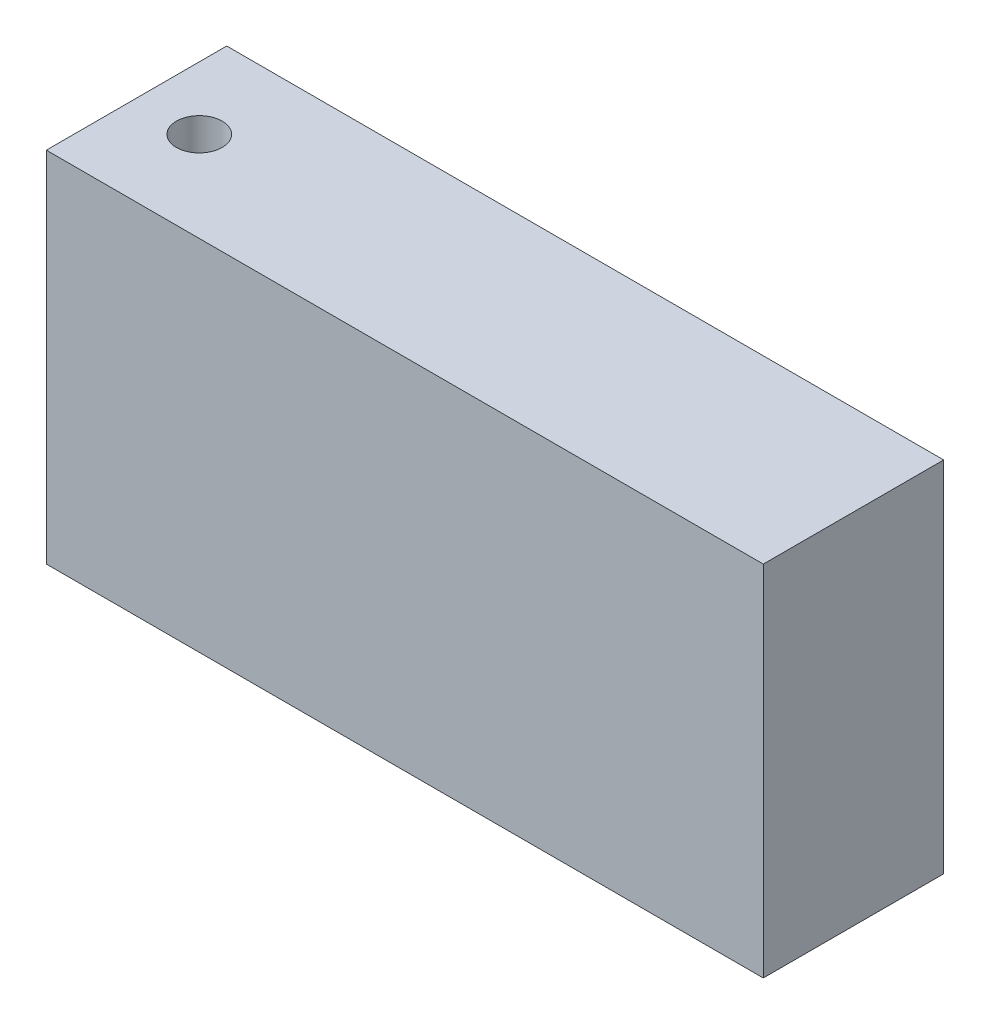
ISO-10303-21;
HEADER;
FILE_DESCRIPTION(('STEP AP214'),'2;1');
FILE_NAME('part.step','',(''),(''),'','','');
FILE_SCHEMA(('AUTOMOTIVE_DESIGN { 1 0 10303 214 1 1 1 1 }'));
ENDSEC;
DATA;
#1=APPLICATION_CONTEXT('core data for automotive mechanical design processes');
#2=APPLICATION_PROTOCOL_DEFINITION('international standard','automotive_design',2000,#1);
#3=PRODUCT_CONTEXT('',#1,'mechanical');
#4=PRODUCT('Part','Part','',(#3));
#5=PRODUCT_RELATED_PRODUCT_CATEGORY('part','',(#4));
#6=PRODUCT_DEFINITION_FORMATION('','',#4);
#7=PRODUCT_DEFINITION_CONTEXT('part definition',#1,'design');
#8=PRODUCT_DEFINITION('design','',#6,#7);
#9=PRODUCT_DEFINITION_SHAPE('','',#8);
#10=(LENGTH_UNIT() NAMED_UNIT(*) SI_UNIT(.MILLI.,.METRE.));
#11=(NAMED_UNIT(*) PLANE_ANGLE_UNIT() SI_UNIT($,.RADIAN.));
#12=(NAMED_UNIT(*) SI_UNIT($,.STERADIAN.) SOLID_ANGLE_UNIT());
#13=UNCERTAINTY_MEASURE_WITH_UNIT(LENGTH_MEASURE(1.E-05),#10,'distance_accuracy_value','');
#14=(GEOMETRIC_REPRESENTATION_CONTEXT(3) GLOBAL_UNCERTAINTY_ASSIGNED_CONTEXT((#13)) GLOBAL_UNIT_ASSIGNED_CONTEXT((#10,
#11,#12)) REPRESENTATION_CONTEXT('',''));
#15=CARTESIAN_POINT('',(0.,0.,0.));
#16=DIRECTION('',(0.,0.,1.));
#17=DIRECTION('',(1.,0.,0.));
#18=AXIS2_PLACEMENT_3D('',#15,#16,#17);
#19=CARTESIAN_POINT('',(-50.,50.,12.58));
#20=DIRECTION('',(1.,0.,0.));
#21=DIRECTION('',(0.,0.,-1.));
#22=AXIS2_PLACEMENT_3D('',#19,#20,#21);
#23=PLANE('',#22);
#24=DIRECTION('',(0.,0.,1.));
#25=VECTOR('',#24,1.);
#26=CARTESIAN_POINT('',(-50.,0.,12.58));
#27=LINE('',#26,#25);
#28=CARTESIAN_POINT('',(-50.,0.,-12.58));
#29=VERTEX_POINT('',#28);
#30=CARTESIAN_POINT('',(-50.,0.,12.58));
#31=VERTEX_POINT('',#30);
#32=EDGE_CURVE('E96',#29,#31,#27,.T.);
#33=ORIENTED_EDGE('',*,*,#32,.T.);
#34=DIRECTION('',(0.,-1.,0.));
#35=VECTOR('',#34,1.);
#36=CARTESIAN_POINT('',(-50.,50.,12.58));
#37=LINE('',#36,#35);
#38=CARTESIAN_POINT('',(-50.,50.,12.58));
#39=VERTEX_POINT('',#38);
#40=EDGE_CURVE('E11',#39,#31,#37,.T.);
#41=ORIENTED_EDGE('',*,*,#40,.F.);
#42=DIRECTION('',(0.,0.,1.));
#43=VECTOR('',#42,1.);
#44=CARTESIAN_POINT('',(-50.,50.,12.58));
#45=LINE('',#44,#43);
#46=CARTESIAN_POINT('',(-50.,50.,-12.58));
#47=VERTEX_POINT('',#46);
#48=EDGE_CURVE('E84',#47,#39,#45,.T.);
#49=ORIENTED_EDGE('',*,*,#48,.F.);
#50=DIRECTION('',(0.,-1.,0.));
#51=VECTOR('',#50,1.);
#52=CARTESIAN_POINT('',(-50.,50.,-12.58));
#53=LINE('',#52,#51);
#54=EDGE_CURVE('E92',#47,#29,#53,.T.);
#55=ORIENTED_EDGE('',*,*,#54,.T.);
#56=EDGE_LOOP('',(#33,#41,#49,#55));
#57=FACE_BOUND('',#56,.T.);
#58=ADVANCED_FACE('F33',(#57),#23,.F.);
#59=CARTESIAN_POINT('',(50.,50.,12.58));
#60=DIRECTION('',(0.,0.,-1.));
#61=DIRECTION('',(-1.,0.,0.));
#62=AXIS2_PLACEMENT_3D('',#59,#60,#61);
#63=PLANE('',#62);
#64=DIRECTION('',(1.,0.,0.));
#65=VECTOR('',#64,1.);
#66=CARTESIAN_POINT('',(50.,0.,12.58));
#67=LINE('',#66,#65);
#68=CARTESIAN_POINT('',(50.,0.,12.58));
#69=VERTEX_POINT('',#68);
#70=EDGE_CURVE('E88',#31,#69,#67,.T.);
#71=ORIENTED_EDGE('',*,*,#70,.T.);
#72=DIRECTION('',(0.,-1.,0.));
#73=VECTOR('',#72,1.);
#74=CARTESIAN_POINT('',(50.,50.,12.58));
#75=LINE('',#74,#73);
#76=CARTESIAN_POINT('',(50.,50.,12.58));
#77=VERTEX_POINT('',#76);
#78=EDGE_CURVE('E41',#77,#69,#75,.T.);
#79=ORIENTED_EDGE('',*,*,#78,.F.);
#80=DIRECTION('',(1.,0.,0.));
#81=VECTOR('',#80,1.);
#82=CARTESIAN_POINT('',(50.,50.,12.58));
#83=LINE('',#82,#81);
#84=EDGE_CURVE('E79',#39,#77,#83,.T.);
#85=ORIENTED_EDGE('',*,*,#84,.F.);
#86=ORIENTED_EDGE('',*,*,#40,.T.);
#87=EDGE_LOOP('',(#71,#79,#85,#86));
#88=FACE_BOUND('',#87,.T.);
#89=ADVANCED_FACE('F87',(#88),#63,.F.);
#90=CARTESIAN_POINT('',(50.,50.,12.58));
#91=DIRECTION('',(-1.,0.,0.));
#92=DIRECTION('',(0.,0.,1.));
#93=AXIS2_PLACEMENT_3D('',#90,#91,#92);
#94=PLANE('',#93);
#95=DIRECTION('',(0.,0.,-1.));
#96=VECTOR('',#95,1.);
#97=CARTESIAN_POINT('',(50.,0.,12.58));
#98=LINE('',#97,#96);
#99=CARTESIAN_POINT('',(50.,0.,-12.58));
#100=VERTEX_POINT('',#99);
#101=EDGE_CURVE('E66',#69,#100,#98,.T.);
#102=ORIENTED_EDGE('',*,*,#101,.T.);
#103=DIRECTION('',(0.,-1.,0.));
#104=VECTOR('',#103,1.);
#105=CARTESIAN_POINT('',(50.,50.,-12.58));
#106=LINE('',#105,#104);
#107=CARTESIAN_POINT('',(50.,50.,-12.58));
#108=VERTEX_POINT('',#107);
#109=EDGE_CURVE('E89',#108,#100,#106,.T.);
#110=ORIENTED_EDGE('',*,*,#109,.F.);
#111=DIRECTION('',(0.,0.,-1.));
#112=VECTOR('',#111,1.);
#113=CARTESIAN_POINT('',(50.,50.,12.58));
#114=LINE('',#113,#112);
#115=EDGE_CURVE('E82',#77,#108,#114,.T.);
#116=ORIENTED_EDGE('',*,*,#115,.F.);
#117=ORIENTED_EDGE('',*,*,#78,.T.);
#118=EDGE_LOOP('',(#102,#110,#116,#117));
#119=FACE_BOUND('',#118,.T.);
#120=ADVANCED_FACE('F90',(#119),#94,.F.);
#121=CARTESIAN_POINT('',(50.,50.,-12.58));
#122=DIRECTION('',(0.,0.,1.));
#123=DIRECTION('',(1.,0.,0.));
#124=AXIS2_PLACEMENT_3D('',#121,#122,#123);
#125=PLANE('',#124);
#126=DIRECTION('',(-1.,0.,0.));
#127=VECTOR('',#126,1.);
#128=CARTESIAN_POINT('',(50.,0.,-12.58));
#129=LINE('',#128,#127);
#130=EDGE_CURVE('E72',#100,#29,#129,.T.);
#131=ORIENTED_EDGE('',*,*,#130,.T.);
#132=ORIENTED_EDGE('',*,*,#54,.F.);
#133=DIRECTION('',(-1.,0.,0.));
#134=VECTOR('',#133,1.);
#135=CARTESIAN_POINT('',(50.,50.,-12.58));
#136=LINE('',#135,#134);
#137=EDGE_CURVE('E49',#108,#47,#136,.T.);
#138=ORIENTED_EDGE('',*,*,#137,.F.);
#139=ORIENTED_EDGE('',*,*,#109,.T.);
#140=EDGE_LOOP('',(#131,#132,#138,#139));
#141=FACE_BOUND('',#140,.T.);
#142=ADVANCED_FACE('F104',(#141),#125,.F.);
#143=CARTESIAN_POINT('',(0.,50.,0.));
#144=DIRECTION('',(0.,1.,0.));
#145=DIRECTION('',(0.,0.,1.));
#146=AXIS2_PLACEMENT_3D('',#143,#144,#145);
#147=PLANE('',#146);
#148=CARTESIAN_POINT('',(-41.25,50.,0.));
#149=DIRECTION('',(0.,1.,0.));
#150=DIRECTION('',(0.,0.,1.));
#151=AXIS2_PLACEMENT_3D('',#148,#149,#150);
#152=CIRCLE('',#151,3.19);
#153=CARTESIAN_POINT('',(-41.25,50.,3.18999999999999));
#154=VERTEX_POINT('',#153);
#155=EDGE_CURVE('E110',#154,#154,#152,.T.);
#156=ORIENTED_EDGE('',*,*,#155,.F.);
#157=EDGE_LOOP('',(#156));
#158=FACE_BOUND('',#157,.T.);
#159=ORIENTED_EDGE('',*,*,#48,.T.);
#160=ORIENTED_EDGE('',*,*,#84,.T.);
#161=ORIENTED_EDGE('',*,*,#115,.T.);
#162=ORIENTED_EDGE('',*,*,#137,.T.);
#163=EDGE_LOOP('',(#159,#160,#161,#162));
#164=FACE_BOUND('',#163,.T.);
#165=ADVANCED_FACE('F80',(#158,#164),#147,.T.);
#166=CARTESIAN_POINT('',(0.,0.,0.));
#167=DIRECTION('',(0.,1.,0.));
#168=DIRECTION('',(0.,0.,1.));
#169=AXIS2_PLACEMENT_3D('',#166,#167,#168);
#170=PLANE('',#169);
#171=ORIENTED_EDGE('',*,*,#32,.F.);
#172=ORIENTED_EDGE('',*,*,#130,.F.);
#173=ORIENTED_EDGE('',*,*,#101,.F.);
#174=ORIENTED_EDGE('',*,*,#70,.F.);
#175=EDGE_LOOP('',(#171,#172,#173,#174));
#176=FACE_BOUND('',#175,.T.);
#177=ADVANCED_FACE('F107',(#176),#170,.F.);
#178=CARTESIAN_POINT('',(-41.25,42.,0.));
#179=DIRECTION('',(0.,1.,0.));
#180=DIRECTION('',(0.,0.,1.));
#181=AXIS2_PLACEMENT_3D('',#178,#179,#180);
#182=CYLINDRICAL_SURFACE('',#181,3.19);
#183=CARTESIAN_POINT('',(-41.25,42.,0.));
#184=DIRECTION('',(0.,1.,0.));
#185=DIRECTION('',(0.,0.,1.));
#186=AXIS2_PLACEMENT_3D('',#183,#184,#185);
#187=CIRCLE('',#186,3.19);
#188=CARTESIAN_POINT('',(-41.25,42.,3.18999999999999));
#189=VERTEX_POINT('',#188);
#190=EDGE_CURVE('E99',#189,#189,#187,.T.);
#191=ORIENTED_EDGE('',*,*,#190,.F.);
#192=EDGE_LOOP('',(#191));
#193=FACE_BOUND('',#192,.T.);
#194=ORIENTED_EDGE('',*,*,#155,.T.);
#195=EDGE_LOOP('',(#194));
#196=FACE_BOUND('',#195,.T.);
#197=ADVANCED_FACE('F118',(#193,#196),#182,.F.);
#198=CARTESIAN_POINT('',(-41.25,42.,0.));
#199=DIRECTION('',(0.,1.,0.));
#200=DIRECTION('',(0.,0.,1.));
#201=AXIS2_PLACEMENT_3D('',#198,#199,#200);
#202=PLANE('',#201);
#203=ORIENTED_EDGE('',*,*,#190,.T.);
#204=EDGE_LOOP('',(#203));
#205=FACE_BOUND('',#204,.T.);
#206=ADVANCED_FACE('F116',(#205),#202,.T.);
#207=CLOSED_SHELL('',(#58,#89,#120,#142,#165,#177,#197,#206));
#208=MANIFOLD_SOLID_BREP('B2',#207);
#209=ADVANCED_BREP_SHAPE_REPRESENTATION('',(#18,#208),#14);
#210=SHAPE_DEFINITION_REPRESENTATION(#9,#209);
ENDSEC;
END-ISO-10303-21;
